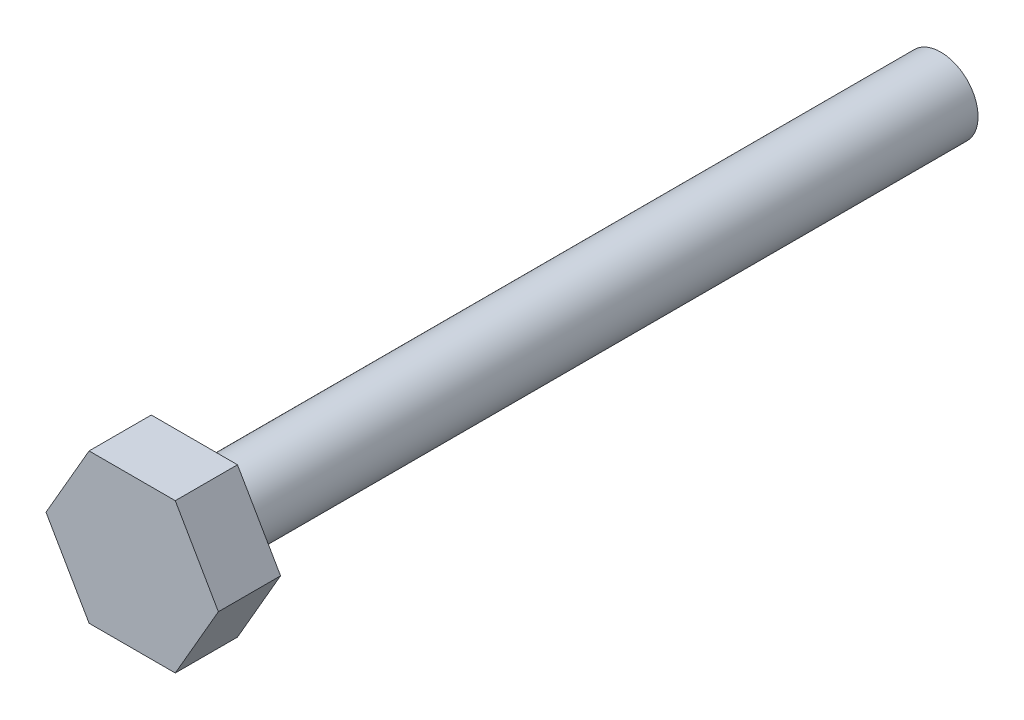
ISO-10303-21;
HEADER;
FILE_DESCRIPTION(('STEP AP214'),'2;1');
FILE_NAME('part.step','',(''),(''),'','','');
FILE_SCHEMA(('AUTOMOTIVE_DESIGN { 1 0 10303 214 1 1 1 1 }'));
ENDSEC;
DATA;
#1=APPLICATION_CONTEXT('core data for automotive mechanical design processes');
#2=APPLICATION_PROTOCOL_DEFINITION('international standard','automotive_design',2000,#1);
#3=PRODUCT_CONTEXT('',#1,'mechanical');
#4=PRODUCT('Part','Part','',(#3));
#5=PRODUCT_RELATED_PRODUCT_CATEGORY('part','',(#4));
#6=PRODUCT_DEFINITION_FORMATION('','',#4);
#7=PRODUCT_DEFINITION_CONTEXT('part definition',#1,'design');
#8=PRODUCT_DEFINITION('design','',#6,#7);
#9=PRODUCT_DEFINITION_SHAPE('','',#8);
#10=(LENGTH_UNIT() NAMED_UNIT(*) SI_UNIT(.MILLI.,.METRE.));
#11=(NAMED_UNIT(*) PLANE_ANGLE_UNIT() SI_UNIT($,.RADIAN.));
#12=(NAMED_UNIT(*) SI_UNIT($,.STERADIAN.) SOLID_ANGLE_UNIT());
#13=UNCERTAINTY_MEASURE_WITH_UNIT(LENGTH_MEASURE(1.E-05),#10,'distance_accuracy_value','');
#14=(GEOMETRIC_REPRESENTATION_CONTEXT(3) GLOBAL_UNCERTAINTY_ASSIGNED_CONTEXT((#13)) GLOBAL_UNIT_ASSIGNED_CONTEXT((#10,
#11,#12)) REPRESENTATION_CONTEXT('',''));
#15=CARTESIAN_POINT('',(0.,0.,0.));
#16=DIRECTION('',(0.,0.,1.));
#17=DIRECTION('',(1.,0.,0.));
#18=AXIS2_PLACEMENT_3D('',#15,#16,#17);
#19=CARTESIAN_POINT('',(6.92820323027551,0.,5.));
#20=DIRECTION('',(-0.866025403784439,-0.5,0.));
#21=DIRECTION('',(0.5,-0.866025403784439,0.));
#22=AXIS2_PLACEMENT_3D('',#19,#20,#21);
#23=PLANE('',#22);
#24=DIRECTION('',(-0.5,0.866025403784439,0.));
#25=VECTOR('',#24,1.);
#26=CARTESIAN_POINT('',(6.92820323027551,0.,0.));
#27=LINE('',#26,#25);
#28=CARTESIAN_POINT('',(6.92820323027551,0.,0.));
#29=VERTEX_POINT('',#28);
#30=CARTESIAN_POINT('',(3.46410161513775,6.,0.));
#31=VERTEX_POINT('',#30);
#32=EDGE_CURVE('E132',#29,#31,#27,.T.);
#33=ORIENTED_EDGE('',*,*,#32,.T.);
#34=DIRECTION('',(0.,0.,-1.));
#35=VECTOR('',#34,1.);
#36=CARTESIAN_POINT('',(3.46410161513775,6.,5.));
#37=LINE('',#36,#35);
#38=CARTESIAN_POINT('',(3.46410161513775,6.,5.));
#39=VERTEX_POINT('',#38);
#40=EDGE_CURVE('E44',#39,#31,#37,.T.);
#41=ORIENTED_EDGE('',*,*,#40,.F.);
#42=DIRECTION('',(-0.5,0.866025403784439,0.));
#43=VECTOR('',#42,1.);
#44=CARTESIAN_POINT('',(6.92820323027551,0.,5.));
#45=LINE('',#44,#43);
#46=CARTESIAN_POINT('',(6.92820323027551,0.,5.));
#47=VERTEX_POINT('',#46);
#48=EDGE_CURVE('E149',#47,#39,#45,.T.);
#49=ORIENTED_EDGE('',*,*,#48,.F.);
#50=DIRECTION('',(0.,0.,-1.));
#51=VECTOR('',#50,1.);
#52=CARTESIAN_POINT('',(6.92820323027551,0.,5.));
#53=LINE('',#52,#51);
#54=EDGE_CURVE('E128',#47,#29,#53,.T.);
#55=ORIENTED_EDGE('',*,*,#54,.T.);
#56=EDGE_LOOP('',(#33,#41,#49,#55));
#57=FACE_BOUND('',#56,.T.);
#58=ADVANCED_FACE('F41',(#57),#23,.F.);
#59=CARTESIAN_POINT('',(3.46410161513775,6.,5.));
#60=DIRECTION('',(0.,-1.,0.));
#61=DIRECTION('',(1.,0.,0.));
#62=AXIS2_PLACEMENT_3D('',#59,#60,#61);
#63=PLANE('',#62);
#64=DIRECTION('',(-1.,0.,0.));
#65=VECTOR('',#64,1.);
#66=CARTESIAN_POINT('',(3.46410161513775,6.,0.));
#67=LINE('',#66,#65);
#68=CARTESIAN_POINT('',(-3.46410161513775,6.,0.));
#69=VERTEX_POINT('',#68);
#70=EDGE_CURVE('E136',#31,#69,#67,.T.);
#71=ORIENTED_EDGE('',*,*,#70,.T.);
#72=DIRECTION('',(0.,0.,-1.));
#73=VECTOR('',#72,1.);
#74=CARTESIAN_POINT('',(-3.46410161513775,6.,5.));
#75=LINE('',#74,#73);
#76=CARTESIAN_POINT('',(-3.46410161513775,6.,5.));
#77=VERTEX_POINT('',#76);
#78=EDGE_CURVE('E155',#77,#69,#75,.T.);
#79=ORIENTED_EDGE('',*,*,#78,.F.);
#80=DIRECTION('',(-1.,0.,0.));
#81=VECTOR('',#80,1.);
#82=CARTESIAN_POINT('',(3.46410161513775,6.,5.));
#83=LINE('',#82,#81);
#84=EDGE_CURVE('E97',#39,#77,#83,.T.);
#85=ORIENTED_EDGE('',*,*,#84,.F.);
#86=ORIENTED_EDGE('',*,*,#40,.T.);
#87=EDGE_LOOP('',(#71,#79,#85,#86));
#88=FACE_BOUND('',#87,.T.);
#89=ADVANCED_FACE('F162',(#88),#63,.F.);
#90=CARTESIAN_POINT('',(-3.46410161513775,6.,5.));
#91=DIRECTION('',(0.866025403784439,-0.5,0.));
#92=DIRECTION('',(0.5,0.866025403784439,0.));
#93=AXIS2_PLACEMENT_3D('',#90,#91,#92);
#94=PLANE('',#93);
#95=DIRECTION('',(-0.5,-0.866025403784439,0.));
#96=VECTOR('',#95,1.);
#97=CARTESIAN_POINT('',(-3.46410161513775,6.,0.));
#98=LINE('',#97,#96);
#99=CARTESIAN_POINT('',(-6.92820323027551,0.,0.));
#100=VERTEX_POINT('',#99);
#101=EDGE_CURVE('E140',#69,#100,#98,.T.);
#102=ORIENTED_EDGE('',*,*,#101,.T.);
#103=DIRECTION('',(0.,0.,-1.));
#104=VECTOR('',#103,1.);
#105=CARTESIAN_POINT('',(-6.92820323027551,0.,5.));
#106=LINE('',#105,#104);
#107=CARTESIAN_POINT('',(-6.92820323027551,0.,5.));
#108=VERTEX_POINT('',#107);
#109=EDGE_CURVE('E121',#108,#100,#106,.T.);
#110=ORIENTED_EDGE('',*,*,#109,.F.);
#111=DIRECTION('',(-0.5,-0.866025403784439,0.));
#112=VECTOR('',#111,1.);
#113=CARTESIAN_POINT('',(-3.46410161513775,6.,5.));
#114=LINE('',#113,#112);
#115=EDGE_CURVE('E110',#77,#108,#114,.T.);
#116=ORIENTED_EDGE('',*,*,#115,.F.);
#117=ORIENTED_EDGE('',*,*,#78,.T.);
#118=EDGE_LOOP('',(#102,#110,#116,#117));
#119=FACE_BOUND('',#118,.T.);
#120=ADVANCED_FACE('F168',(#119),#94,.F.);
#121=CARTESIAN_POINT('',(-6.92820323027551,0.,5.));
#122=DIRECTION('',(0.866025403784439,0.5,0.));
#123=DIRECTION('',(-0.5,0.866025403784439,0.));
#124=AXIS2_PLACEMENT_3D('',#121,#122,#123);
#125=PLANE('',#124);
#126=DIRECTION('',(0.5,-0.866025403784438,0.));
#127=VECTOR('',#126,1.);
#128=CARTESIAN_POINT('',(-6.92820323027551,0.,0.));
#129=LINE('',#128,#127);
#130=CARTESIAN_POINT('',(-3.46410161513775,-6.,0.));
#131=VERTEX_POINT('',#130);
#132=EDGE_CURVE('E119',#100,#131,#129,.T.);
#133=ORIENTED_EDGE('',*,*,#132,.T.);
#134=DIRECTION('',(0.,0.,-1.));
#135=VECTOR('',#134,1.);
#136=CARTESIAN_POINT('',(-3.46410161513775,-6.,5.));
#137=LINE('',#136,#135);
#138=CARTESIAN_POINT('',(-3.46410161513775,-6.,5.));
#139=VERTEX_POINT('',#138);
#140=EDGE_CURVE('E116',#139,#131,#137,.T.);
#141=ORIENTED_EDGE('',*,*,#140,.F.);
#142=DIRECTION('',(0.5,-0.866025403784438,0.));
#143=VECTOR('',#142,1.);
#144=CARTESIAN_POINT('',(-6.92820323027551,0.,5.));
#145=LINE('',#144,#143);
#146=EDGE_CURVE('E104',#108,#139,#145,.T.);
#147=ORIENTED_EDGE('',*,*,#146,.F.);
#148=ORIENTED_EDGE('',*,*,#109,.T.);
#149=EDGE_LOOP('',(#133,#141,#147,#148));
#150=FACE_BOUND('',#149,.T.);
#151=ADVANCED_FACE('F117',(#150),#125,.F.);
#152=CARTESIAN_POINT('',(-3.46410161513775,-6.,5.));
#153=DIRECTION('',(0.,1.,0.));
#154=DIRECTION('',(-1.,0.,0.));
#155=AXIS2_PLACEMENT_3D('',#152,#153,#154);
#156=PLANE('',#155);
#157=DIRECTION('',(1.,0.,0.));
#158=VECTOR('',#157,1.);
#159=CARTESIAN_POINT('',(-3.46410161513775,-6.,0.));
#160=LINE('',#159,#158);
#161=CARTESIAN_POINT('',(3.46410161513776,-6.,0.));
#162=VERTEX_POINT('',#161);
#163=EDGE_CURVE('E82',#131,#162,#160,.T.);
#164=ORIENTED_EDGE('',*,*,#163,.T.);
#165=DIRECTION('',(0.,0.,-1.));
#166=VECTOR('',#165,1.);
#167=CARTESIAN_POINT('',(3.46410161513776,-6.,5.));
#168=LINE('',#167,#166);
#169=CARTESIAN_POINT('',(3.46410161513776,-6.,5.));
#170=VERTEX_POINT('',#169);
#171=EDGE_CURVE('E122',#170,#162,#168,.T.);
#172=ORIENTED_EDGE('',*,*,#171,.F.);
#173=DIRECTION('',(1.,0.,0.));
#174=VECTOR('',#173,1.);
#175=CARTESIAN_POINT('',(-3.46410161513775,-6.,5.));
#176=LINE('',#175,#174);
#177=EDGE_CURVE('E108',#139,#170,#176,.T.);
#178=ORIENTED_EDGE('',*,*,#177,.F.);
#179=ORIENTED_EDGE('',*,*,#140,.T.);
#180=EDGE_LOOP('',(#164,#172,#178,#179));
#181=FACE_BOUND('',#180,.T.);
#182=ADVANCED_FACE('F124',(#181),#156,.F.);
#183=CARTESIAN_POINT('',(3.46410161513776,-6.,5.));
#184=DIRECTION('',(-0.866025403784439,0.5,0.));
#185=DIRECTION('',(-0.5,-0.866025403784439,0.));
#186=AXIS2_PLACEMENT_3D('',#183,#184,#185);
#187=PLANE('',#186);
#188=DIRECTION('',(0.5,0.866025403784439,0.));
#189=VECTOR('',#188,1.);
#190=CARTESIAN_POINT('',(3.46410161513776,-6.,0.));
#191=LINE('',#190,#189);
#192=EDGE_CURVE('E88',#162,#29,#191,.T.);
#193=ORIENTED_EDGE('',*,*,#192,.T.);
#194=ORIENTED_EDGE('',*,*,#54,.F.);
#195=DIRECTION('',(0.5,0.866025403784439,0.));
#196=VECTOR('',#195,1.);
#197=CARTESIAN_POINT('',(3.46410161513776,-6.,5.));
#198=LINE('',#197,#196);
#199=EDGE_CURVE('E59',#170,#47,#198,.T.);
#200=ORIENTED_EDGE('',*,*,#199,.F.);
#201=ORIENTED_EDGE('',*,*,#171,.T.);
#202=EDGE_LOOP('',(#193,#194,#200,#201));
#203=FACE_BOUND('',#202,.T.);
#204=ADVANCED_FACE('F192',(#203),#187,.F.);
#205=CARTESIAN_POINT('',(0.,0.,5.));
#206=DIRECTION('',(0.,0.,1.));
#207=DIRECTION('',(1.,0.,0.));
#208=AXIS2_PLACEMENT_3D('',#205,#206,#207);
#209=PLANE('',#208);
#210=ORIENTED_EDGE('',*,*,#48,.T.);
#211=ORIENTED_EDGE('',*,*,#84,.T.);
#212=ORIENTED_EDGE('',*,*,#115,.T.);
#213=ORIENTED_EDGE('',*,*,#146,.T.);
#214=ORIENTED_EDGE('',*,*,#177,.T.);
#215=ORIENTED_EDGE('',*,*,#199,.T.);
#216=EDGE_LOOP('',(#210,#211,#212,#213,#214,#215));
#217=FACE_BOUND('',#216,.T.);
#218=ADVANCED_FACE('F106',(#217),#209,.T.);
#219=CARTESIAN_POINT('',(0.,0.,0.));
#220=DIRECTION('',(0.,0.,1.));
#221=DIRECTION('',(1.,0.,0.));
#222=AXIS2_PLACEMENT_3D('',#219,#220,#221);
#223=PLANE('',#222);
#224=CARTESIAN_POINT('',(0.,0.,0.));
#225=DIRECTION('',(0.,0.,-1.));
#226=DIRECTION('',(-1.,0.,0.));
#227=AXIS2_PLACEMENT_3D('',#224,#225,#226);
#228=CIRCLE('',#227,3.);
#229=CARTESIAN_POINT('',(-3.,0.,0.));
#230=VERTEX_POINT('',#229);
#231=EDGE_CURVE('E11',#230,#230,#228,.T.);
#232=ORIENTED_EDGE('',*,*,#231,.F.);
#233=EDGE_LOOP('',(#232));
#234=FACE_BOUND('',#233,.T.);
#235=ORIENTED_EDGE('',*,*,#32,.F.);
#236=ORIENTED_EDGE('',*,*,#192,.F.);
#237=ORIENTED_EDGE('',*,*,#163,.F.);
#238=ORIENTED_EDGE('',*,*,#132,.F.);
#239=ORIENTED_EDGE('',*,*,#101,.F.);
#240=ORIENTED_EDGE('',*,*,#70,.F.);
#241=EDGE_LOOP('',(#235,#236,#237,#238,#239,#240));
#242=FACE_BOUND('',#241,.T.);
#243=ADVANCED_FACE('F167',(#234,#242),#223,.F.);
#244=CARTESIAN_POINT('',(0.,0.,-60.));
#245=DIRECTION('',(0.,0.,1.));
#246=DIRECTION('',(1.,0.,0.));
#247=AXIS2_PLACEMENT_3D('',#244,#245,#246);
#248=CYLINDRICAL_SURFACE('',#247,3.);
#249=CARTESIAN_POINT('',(0.,0.,-60.));
#250=DIRECTION('',(0.,0.,-1.));
#251=DIRECTION('',(-1.,0.,0.));
#252=AXIS2_PLACEMENT_3D('',#249,#250,#251);
#253=CIRCLE('',#252,3.);
#254=CARTESIAN_POINT('',(-3.,0.,-60.));
#255=VERTEX_POINT('',#254);
#256=EDGE_CURVE('E137',#255,#255,#253,.T.);
#257=ORIENTED_EDGE('',*,*,#256,.F.);
#258=EDGE_LOOP('',(#257));
#259=FACE_BOUND('',#258,.T.);
#260=ORIENTED_EDGE('',*,*,#231,.T.);
#261=EDGE_LOOP('',(#260));
#262=FACE_BOUND('',#261,.T.);
#263=ADVANCED_FACE('F181',(#259,#262),#248,.T.);
#264=CARTESIAN_POINT('',(0.,0.,-60.));
#265=DIRECTION('',(0.,0.,-1.));
#266=DIRECTION('',(-1.,0.,0.));
#267=AXIS2_PLACEMENT_3D('',#264,#265,#266);
#268=PLANE('',#267);
#269=ORIENTED_EDGE('',*,*,#256,.T.);
#270=EDGE_LOOP('',(#269));
#271=FACE_BOUND('',#270,.T.);
#272=ADVANCED_FACE('F179',(#271),#268,.T.);
#273=CLOSED_SHELL('',(#58,#89,#120,#151,#182,#204,#218,#243,#263,#272));
#274=MANIFOLD_SOLID_BREP('B2',#273);
#275=ADVANCED_BREP_SHAPE_REPRESENTATION('',(#18,#274),#14);
#276=SHAPE_DEFINITION_REPRESENTATION(#9,#275);
ENDSEC;
END-ISO-10303-21;
